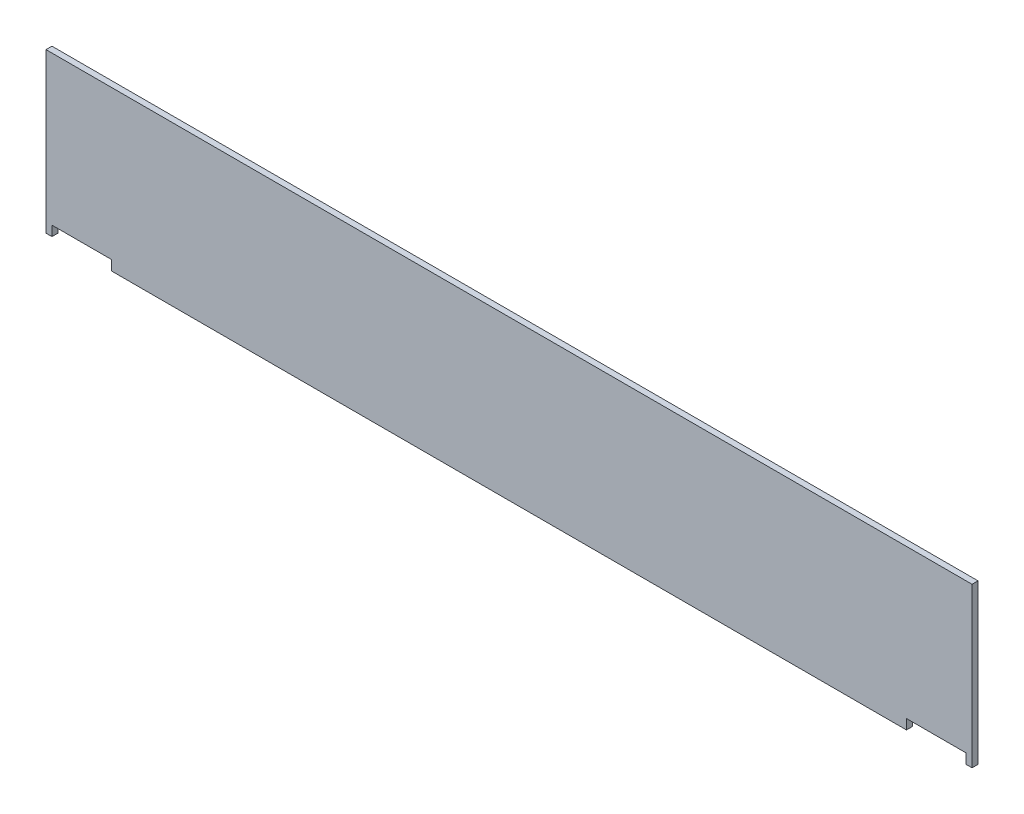
ISO-10303-21;
HEADER;
FILE_DESCRIPTION(('STEP AP214'),'2;1');
FILE_NAME('part.step','',(''),(''),'','','');
FILE_SCHEMA(('AUTOMOTIVE_DESIGN { 1 0 10303 214 1 1 1 1 }'));
ENDSEC;
DATA;
#1=APPLICATION_CONTEXT('core data for automotive mechanical design processes');
#2=APPLICATION_PROTOCOL_DEFINITION('international standard','automotive_design',2000,#1);
#3=PRODUCT_CONTEXT('',#1,'mechanical');
#4=PRODUCT('Part','Part','',(#3));
#5=PRODUCT_RELATED_PRODUCT_CATEGORY('part','',(#4));
#6=PRODUCT_DEFINITION_FORMATION('','',#4);
#7=PRODUCT_DEFINITION_CONTEXT('part definition',#1,'design');
#8=PRODUCT_DEFINITION('design','',#6,#7);
#9=PRODUCT_DEFINITION_SHAPE('','',#8);
#10=(LENGTH_UNIT() NAMED_UNIT(*) SI_UNIT(.MILLI.,.METRE.));
#11=(NAMED_UNIT(*) PLANE_ANGLE_UNIT() SI_UNIT($,.RADIAN.));
#12=(NAMED_UNIT(*) SI_UNIT($,.STERADIAN.) SOLID_ANGLE_UNIT());
#13=UNCERTAINTY_MEASURE_WITH_UNIT(LENGTH_MEASURE(1.E-05),#10,'distance_accuracy_value','');
#14=(GEOMETRIC_REPRESENTATION_CONTEXT(3) GLOBAL_UNCERTAINTY_ASSIGNED_CONTEXT((#13)) GLOBAL_UNIT_ASSIGNED_CONTEXT((#10,
#11,#12)) REPRESENTATION_CONTEXT('',''));
#15=CARTESIAN_POINT('',(0.,0.,0.));
#16=DIRECTION('',(0.,0.,1.));
#17=DIRECTION('',(1.,0.,0.));
#18=AXIS2_PLACEMENT_3D('',#15,#16,#17);
#19=CARTESIAN_POINT('',(-223.652524031518,0.,3.));
#20=DIRECTION('',(0.,1.,0.));
#21=DIRECTION('',(-1.,0.,0.));
#22=AXIS2_PLACEMENT_3D('',#19,#20,#21);
#23=PLANE('',#22);
#24=DIRECTION('',(1.,0.,0.));
#25=VECTOR('',#24,1.);
#26=CARTESIAN_POINT('',(-223.652524031518,0.,0.));
#27=LINE('',#26,#25);
#28=CARTESIAN_POINT('',(-226.652524031518,0.,0.));
#29=VERTEX_POINT('',#28);
#30=CARTESIAN_POINT('',(-223.652524031518,0.,0.));
#31=VERTEX_POINT('',#30);
#32=EDGE_CURVE('E153',#29,#31,#27,.T.);
#33=ORIENTED_EDGE('',*,*,#32,.T.);
#34=DIRECTION('',(0.,0.,-1.));
#35=VECTOR('',#34,1.);
#36=CARTESIAN_POINT('',(-223.652524031518,0.,3.));
#37=LINE('',#36,#35);
#38=CARTESIAN_POINT('',(-223.652524031518,0.,3.));
#39=VERTEX_POINT('',#38);
#40=EDGE_CURVE('E11',#39,#31,#37,.T.);
#41=ORIENTED_EDGE('',*,*,#40,.F.);
#42=DIRECTION('',(1.,0.,0.));
#43=VECTOR('',#42,1.);
#44=CARTESIAN_POINT('',(-223.652524031518,0.,3.));
#45=LINE('',#44,#43);
#46=CARTESIAN_POINT('',(-226.652524031518,0.,3.));
#47=VERTEX_POINT('',#46);
#48=EDGE_CURVE('E175',#47,#39,#45,.T.);
#49=ORIENTED_EDGE('',*,*,#48,.F.);
#50=DIRECTION('',(0.,0.,-1.));
#51=VECTOR('',#50,1.);
#52=CARTESIAN_POINT('',(-226.652524031518,0.,3.));
#53=LINE('',#52,#51);
#54=EDGE_CURVE('E149',#47,#29,#53,.T.);
#55=ORIENTED_EDGE('',*,*,#54,.T.);
#56=EDGE_LOOP('',(#33,#41,#49,#55));
#57=FACE_BOUND('',#56,.T.);
#58=ADVANCED_FACE('F33',(#57),#23,.F.);
#59=CARTESIAN_POINT('',(-223.652524031518,4.99999999999996,3.));
#60=DIRECTION('',(-1.,0.,0.));
#61=DIRECTION('',(0.,-1.,0.));
#62=AXIS2_PLACEMENT_3D('',#59,#60,#61);
#63=PLANE('',#62);
#64=DIRECTION('',(0.,1.,0.));
#65=VECTOR('',#64,1.);
#66=CARTESIAN_POINT('',(-223.652524031518,4.99999999999996,0.));
#67=LINE('',#66,#65);
#68=CARTESIAN_POINT('',(-223.652524031518,4.99999999999996,0.));
#69=VERTEX_POINT('',#68);
#70=EDGE_CURVE('E156',#31,#69,#67,.T.);
#71=ORIENTED_EDGE('',*,*,#70,.T.);
#72=DIRECTION('',(0.,0.,-1.));
#73=VECTOR('',#72,1.);
#74=CARTESIAN_POINT('',(-223.652524031518,4.99999999999996,3.));
#75=LINE('',#74,#73);
#76=CARTESIAN_POINT('',(-223.652524031518,4.99999999999996,3.));
#77=VERTEX_POINT('',#76);
#78=EDGE_CURVE('E41',#77,#69,#75,.T.);
#79=ORIENTED_EDGE('',*,*,#78,.F.);
#80=DIRECTION('',(0.,1.,0.));
#81=VECTOR('',#80,1.);
#82=CARTESIAN_POINT('',(-223.652524031518,4.99999999999996,3.));
#83=LINE('',#82,#81);
#84=EDGE_CURVE('E104',#39,#77,#83,.T.);
#85=ORIENTED_EDGE('',*,*,#84,.F.);
#86=ORIENTED_EDGE('',*,*,#40,.T.);
#87=EDGE_LOOP('',(#71,#79,#85,#86));
#88=FACE_BOUND('',#87,.T.);
#89=ADVANCED_FACE('F253',(#88),#63,.F.);
#90=CARTESIAN_POINT('',(-193.652524031518,4.99999999999996,3.));
#91=DIRECTION('',(0.,1.,0.));
#92=DIRECTION('',(-1.,0.,0.));
#93=AXIS2_PLACEMENT_3D('',#90,#91,#92);
#94=PLANE('',#93);
#95=DIRECTION('',(1.,0.,0.));
#96=VECTOR('',#95,1.);
#97=CARTESIAN_POINT('',(-193.652524031518,4.99999999999996,0.));
#98=LINE('',#97,#96);
#99=CARTESIAN_POINT('',(-193.652524031518,4.99999999999996,0.));
#100=VERTEX_POINT('',#99);
#101=EDGE_CURVE('E158',#69,#100,#98,.T.);
#102=ORIENTED_EDGE('',*,*,#101,.T.);
#103=DIRECTION('',(0.,0.,-1.));
#104=VECTOR('',#103,1.);
#105=CARTESIAN_POINT('',(-193.652524031518,4.99999999999996,3.));
#106=LINE('',#105,#104);
#107=CARTESIAN_POINT('',(-193.652524031518,4.99999999999996,3.));
#108=VERTEX_POINT('',#107);
#109=EDGE_CURVE('E194',#108,#100,#106,.T.);
#110=ORIENTED_EDGE('',*,*,#109,.F.);
#111=DIRECTION('',(1.,0.,0.));
#112=VECTOR('',#111,1.);
#113=CARTESIAN_POINT('',(-193.652524031518,4.99999999999996,3.));
#114=LINE('',#113,#112);
#115=EDGE_CURVE('E202',#77,#108,#114,.T.);
#116=ORIENTED_EDGE('',*,*,#115,.F.);
#117=ORIENTED_EDGE('',*,*,#78,.T.);
#118=EDGE_LOOP('',(#102,#110,#116,#117));
#119=FACE_BOUND('',#118,.T.);
#120=ADVANCED_FACE('F200',(#119),#94,.F.);
#121=CARTESIAN_POINT('',(-193.652524031518,0.,3.));
#122=DIRECTION('',(1.,0.,0.));
#123=DIRECTION('',(0.,0.,-1.));
#124=AXIS2_PLACEMENT_3D('',#121,#122,#123);
#125=PLANE('',#124);
#126=DIRECTION('',(0.,-1.,0.));
#127=VECTOR('',#126,1.);
#128=CARTESIAN_POINT('',(-193.652524031518,0.,0.));
#129=LINE('',#128,#127);
#130=CARTESIAN_POINT('',(-193.652524031518,0.,0.));
#131=VERTEX_POINT('',#130);
#132=EDGE_CURVE('E160',#100,#131,#129,.T.);
#133=ORIENTED_EDGE('',*,*,#132,.T.);
#134=DIRECTION('',(0.,0.,-1.));
#135=VECTOR('',#134,1.);
#136=CARTESIAN_POINT('',(-193.652524031518,0.,3.));
#137=LINE('',#136,#135);
#138=CARTESIAN_POINT('',(-193.652524031518,0.,3.));
#139=VERTEX_POINT('',#138);
#140=EDGE_CURVE('E191',#139,#131,#137,.T.);
#141=ORIENTED_EDGE('',*,*,#140,.F.);
#142=DIRECTION('',(0.,-1.,0.));
#143=VECTOR('',#142,1.);
#144=CARTESIAN_POINT('',(-193.652524031518,0.,3.));
#145=LINE('',#144,#143);
#146=EDGE_CURVE('E220',#108,#139,#145,.T.);
#147=ORIENTED_EDGE('',*,*,#146,.F.);
#148=ORIENTED_EDGE('',*,*,#109,.T.);
#149=EDGE_LOOP('',(#133,#141,#147,#148));
#150=FACE_BOUND('',#149,.T.);
#151=ADVANCED_FACE('F211',(#150),#125,.F.);
#152=CARTESIAN_POINT('',(206.347475968483,0.,3.));
#153=DIRECTION('',(0.,1.,0.));
#154=DIRECTION('',(-1.,0.,0.));
#155=AXIS2_PLACEMENT_3D('',#152,#153,#154);
#156=PLANE('',#155);
#157=DIRECTION('',(1.,0.,0.));
#158=VECTOR('',#157,1.);
#159=CARTESIAN_POINT('',(206.347475968483,0.,0.));
#160=LINE('',#159,#158);
#161=CARTESIAN_POINT('',(206.347475968483,0.,0.));
#162=VERTEX_POINT('',#161);
#163=EDGE_CURVE('E162',#131,#162,#160,.T.);
#164=ORIENTED_EDGE('',*,*,#163,.T.);
#165=DIRECTION('',(0.,0.,-1.));
#166=VECTOR('',#165,1.);
#167=CARTESIAN_POINT('',(206.347475968483,0.,3.));
#168=LINE('',#167,#166);
#169=CARTESIAN_POINT('',(206.347475968483,0.,3.));
#170=VERTEX_POINT('',#169);
#171=EDGE_CURVE('E188',#170,#162,#168,.T.);
#172=ORIENTED_EDGE('',*,*,#171,.F.);
#173=DIRECTION('',(1.,0.,0.));
#174=VECTOR('',#173,1.);
#175=CARTESIAN_POINT('',(206.347475968483,0.,3.));
#176=LINE('',#175,#174);
#177=EDGE_CURVE('E217',#139,#170,#176,.T.);
#178=ORIENTED_EDGE('',*,*,#177,.F.);
#179=ORIENTED_EDGE('',*,*,#140,.T.);
#180=EDGE_LOOP('',(#164,#172,#178,#179));
#181=FACE_BOUND('',#180,.T.);
#182=ADVANCED_FACE('F215',(#181),#156,.F.);
#183=CARTESIAN_POINT('',(206.347475968483,5.,3.));
#184=DIRECTION('',(-1.,0.,0.));
#185=DIRECTION('',(0.,0.,1.));
#186=AXIS2_PLACEMENT_3D('',#183,#184,#185);
#187=PLANE('',#186);
#188=DIRECTION('',(0.,1.,0.));
#189=VECTOR('',#188,1.);
#190=CARTESIAN_POINT('',(206.347475968483,5.,0.));
#191=LINE('',#190,#189);
#192=CARTESIAN_POINT('',(206.347475968483,5.,0.));
#193=VERTEX_POINT('',#192);
#194=EDGE_CURVE('E164',#162,#193,#191,.T.);
#195=ORIENTED_EDGE('',*,*,#194,.T.);
#196=DIRECTION('',(0.,0.,-1.));
#197=VECTOR('',#196,1.);
#198=CARTESIAN_POINT('',(206.347475968483,5.,3.));
#199=LINE('',#198,#197);
#200=CARTESIAN_POINT('',(206.347475968483,5.,3.));
#201=VERTEX_POINT('',#200);
#202=EDGE_CURVE('E185',#201,#193,#199,.T.);
#203=ORIENTED_EDGE('',*,*,#202,.F.);
#204=DIRECTION('',(0.,1.,0.));
#205=VECTOR('',#204,1.);
#206=CARTESIAN_POINT('',(206.347475968483,5.,3.));
#207=LINE('',#206,#205);
#208=EDGE_CURVE('E219',#170,#201,#207,.T.);
#209=ORIENTED_EDGE('',*,*,#208,.F.);
#210=ORIENTED_EDGE('',*,*,#171,.T.);
#211=EDGE_LOOP('',(#195,#203,#209,#210));
#212=FACE_BOUND('',#211,.T.);
#213=ADVANCED_FACE('F266',(#212),#187,.F.);
#214=CARTESIAN_POINT('',(236.347475968483,5.,3.));
#215=DIRECTION('',(0.,1.,0.));
#216=DIRECTION('',(-1.,0.,0.));
#217=AXIS2_PLACEMENT_3D('',#214,#215,#216);
#218=PLANE('',#217);
#219=DIRECTION('',(1.,0.,0.));
#220=VECTOR('',#219,1.);
#221=CARTESIAN_POINT('',(236.347475968483,5.,0.));
#222=LINE('',#221,#220);
#223=CARTESIAN_POINT('',(236.347475968483,5.,0.));
#224=VERTEX_POINT('',#223);
#225=EDGE_CURVE('E166',#193,#224,#222,.T.);
#226=ORIENTED_EDGE('',*,*,#225,.T.);
#227=DIRECTION('',(0.,0.,-1.));
#228=VECTOR('',#227,1.);
#229=CARTESIAN_POINT('',(236.347475968483,5.,3.));
#230=LINE('',#229,#228);
#231=CARTESIAN_POINT('',(236.347475968483,5.,3.));
#232=VERTEX_POINT('',#231);
#233=EDGE_CURVE('E182',#232,#224,#230,.T.);
#234=ORIENTED_EDGE('',*,*,#233,.F.);
#235=DIRECTION('',(1.,0.,0.));
#236=VECTOR('',#235,1.);
#237=CARTESIAN_POINT('',(236.347475968483,5.,3.));
#238=LINE('',#237,#236);
#239=EDGE_CURVE('E222',#201,#232,#238,.T.);
#240=ORIENTED_EDGE('',*,*,#239,.F.);
#241=ORIENTED_EDGE('',*,*,#202,.T.);
#242=EDGE_LOOP('',(#226,#234,#240,#241));
#243=FACE_BOUND('',#242,.T.);
#244=ADVANCED_FACE('F269',(#243),#218,.F.);
#245=CARTESIAN_POINT('',(236.347475968483,0.,3.));
#246=DIRECTION('',(1.,0.,0.));
#247=DIRECTION('',(0.,0.,-1.));
#248=AXIS2_PLACEMENT_3D('',#245,#246,#247);
#249=PLANE('',#248);
#250=DIRECTION('',(0.,-1.,0.));
#251=VECTOR('',#250,1.);
#252=CARTESIAN_POINT('',(236.347475968483,0.,0.));
#253=LINE('',#252,#251);
#254=CARTESIAN_POINT('',(236.347475968483,0.,0.));
#255=VERTEX_POINT('',#254);
#256=EDGE_CURVE('E168',#224,#255,#253,.T.);
#257=ORIENTED_EDGE('',*,*,#256,.T.);
#258=DIRECTION('',(0.,0.,-1.));
#259=VECTOR('',#258,1.);
#260=CARTESIAN_POINT('',(236.347475968483,0.,3.));
#261=LINE('',#260,#259);
#262=CARTESIAN_POINT('',(236.347475968483,0.,3.));
#263=VERTEX_POINT('',#262);
#264=EDGE_CURVE('E179',#263,#255,#261,.T.);
#265=ORIENTED_EDGE('',*,*,#264,.F.);
#266=DIRECTION('',(0.,-1.,0.));
#267=VECTOR('',#266,1.);
#268=CARTESIAN_POINT('',(236.347475968483,0.,3.));
#269=LINE('',#268,#267);
#270=EDGE_CURVE('E228',#232,#263,#269,.T.);
#271=ORIENTED_EDGE('',*,*,#270,.F.);
#272=ORIENTED_EDGE('',*,*,#233,.T.);
#273=EDGE_LOOP('',(#257,#265,#271,#272));
#274=FACE_BOUND('',#273,.T.);
#275=ADVANCED_FACE('F234',(#274),#249,.F.);
#276=CARTESIAN_POINT('',(239.347475968483,0.,3.));
#277=DIRECTION('',(0.,1.,0.));
#278=DIRECTION('',(-1.,0.,0.));
#279=AXIS2_PLACEMENT_3D('',#276,#277,#278);
#280=PLANE('',#279);
#281=DIRECTION('',(1.,0.,0.));
#282=VECTOR('',#281,1.);
#283=CARTESIAN_POINT('',(239.347475968483,0.,0.));
#284=LINE('',#283,#282);
#285=CARTESIAN_POINT('',(239.347475968483,0.,0.));
#286=VERTEX_POINT('',#285);
#287=EDGE_CURVE('E170',#255,#286,#284,.T.);
#288=ORIENTED_EDGE('',*,*,#287,.T.);
#289=DIRECTION('',(0.,0.,-1.));
#290=VECTOR('',#289,1.);
#291=CARTESIAN_POINT('',(239.347475968483,0.,3.));
#292=LINE('',#291,#290);
#293=CARTESIAN_POINT('',(239.347475968483,0.,3.));
#294=VERTEX_POINT('',#293);
#295=EDGE_CURVE('E144',#294,#286,#292,.T.);
#296=ORIENTED_EDGE('',*,*,#295,.F.);
#297=DIRECTION('',(1.,0.,0.));
#298=VECTOR('',#297,1.);
#299=CARTESIAN_POINT('',(239.347475968483,0.,3.));
#300=LINE('',#299,#298);
#301=EDGE_CURVE('E135',#263,#294,#300,.T.);
#302=ORIENTED_EDGE('',*,*,#301,.F.);
#303=ORIENTED_EDGE('',*,*,#264,.T.);
#304=EDGE_LOOP('',(#288,#296,#302,#303));
#305=FACE_BOUND('',#304,.T.);
#306=ADVANCED_FACE('F238',(#305),#280,.F.);
#307=CARTESIAN_POINT('',(239.347475968483,80.,3.));
#308=DIRECTION('',(-1.,0.,0.));
#309=DIRECTION('',(0.,0.,1.));
#310=AXIS2_PLACEMENT_3D('',#307,#308,#309);
#311=PLANE('',#310);
#312=DIRECTION('',(0.,1.,0.));
#313=VECTOR('',#312,1.);
#314=CARTESIAN_POINT('',(239.347475968483,80.,0.));
#315=LINE('',#314,#313);
#316=CARTESIAN_POINT('',(239.347475968483,80.,0.));
#317=VERTEX_POINT('',#316);
#318=EDGE_CURVE('E143',#286,#317,#315,.T.);
#319=ORIENTED_EDGE('',*,*,#318,.T.);
#320=DIRECTION('',(0.,0.,-1.));
#321=VECTOR('',#320,1.);
#322=CARTESIAN_POINT('',(239.347475968483,80.,3.));
#323=LINE('',#322,#321);
#324=CARTESIAN_POINT('',(239.347475968483,80.,3.));
#325=VERTEX_POINT('',#324);
#326=EDGE_CURVE('E140',#325,#317,#323,.T.);
#327=ORIENTED_EDGE('',*,*,#326,.F.);
#328=DIRECTION('',(0.,1.,0.));
#329=VECTOR('',#328,1.);
#330=CARTESIAN_POINT('',(239.347475968483,80.,3.));
#331=LINE('',#330,#329);
#332=EDGE_CURVE('E129',#294,#325,#331,.T.);
#333=ORIENTED_EDGE('',*,*,#332,.F.);
#334=ORIENTED_EDGE('',*,*,#295,.T.);
#335=EDGE_LOOP('',(#319,#327,#333,#334));
#336=FACE_BOUND('',#335,.T.);
#337=ADVANCED_FACE('F141',(#336),#311,.F.);
#338=CARTESIAN_POINT('',(-226.652524031518,80.,3.));
#339=DIRECTION('',(0.,-1.,0.));
#340=DIRECTION('',(0.,0.,-1.));
#341=AXIS2_PLACEMENT_3D('',#338,#339,#340);
#342=PLANE('',#341);
#343=DIRECTION('',(-1.,0.,0.));
#344=VECTOR('',#343,1.);
#345=CARTESIAN_POINT('',(-226.652524031518,80.,0.));
#346=LINE('',#345,#344);
#347=CARTESIAN_POINT('',(-226.652524031518,80.,0.));
#348=VERTEX_POINT('',#347);
#349=EDGE_CURVE('E90',#317,#348,#346,.T.);
#350=ORIENTED_EDGE('',*,*,#349,.T.);
#351=DIRECTION('',(0.,0.,-1.));
#352=VECTOR('',#351,1.);
#353=CARTESIAN_POINT('',(-226.652524031518,80.,3.));
#354=LINE('',#353,#352);
#355=CARTESIAN_POINT('',(-226.652524031518,80.,3.));
#356=VERTEX_POINT('',#355);
#357=EDGE_CURVE('E145',#356,#348,#354,.T.);
#358=ORIENTED_EDGE('',*,*,#357,.F.);
#359=DIRECTION('',(-1.,0.,0.));
#360=VECTOR('',#359,1.);
#361=CARTESIAN_POINT('',(-226.652524031518,80.,3.));
#362=LINE('',#361,#360);
#363=EDGE_CURVE('E133',#325,#356,#362,.T.);
#364=ORIENTED_EDGE('',*,*,#363,.F.);
#365=ORIENTED_EDGE('',*,*,#326,.T.);
#366=EDGE_LOOP('',(#350,#358,#364,#365));
#367=FACE_BOUND('',#366,.T.);
#368=ADVANCED_FACE('F147',(#367),#342,.F.);
#369=CARTESIAN_POINT('',(-226.652524031518,0.,3.));
#370=DIRECTION('',(1.,0.,0.));
#371=DIRECTION('',(0.,1.,0.));
#372=AXIS2_PLACEMENT_3D('',#369,#370,#371);
#373=PLANE('',#372);
#374=DIRECTION('',(0.,-1.,0.));
#375=VECTOR('',#374,1.);
#376=CARTESIAN_POINT('',(-226.652524031518,0.,0.));
#377=LINE('',#376,#375);
#378=EDGE_CURVE('E96',#348,#29,#377,.T.);
#379=ORIENTED_EDGE('',*,*,#378,.T.);
#380=ORIENTED_EDGE('',*,*,#54,.F.);
#381=DIRECTION('',(0.,-1.,0.));
#382=VECTOR('',#381,1.);
#383=CARTESIAN_POINT('',(-226.652524031518,0.,3.));
#384=LINE('',#383,#382);
#385=EDGE_CURVE('E49',#356,#47,#384,.T.);
#386=ORIENTED_EDGE('',*,*,#385,.F.);
#387=ORIENTED_EDGE('',*,*,#357,.T.);
#388=EDGE_LOOP('',(#379,#380,#386,#387));
#389=FACE_BOUND('',#388,.T.);
#390=ADVANCED_FACE('F242',(#389),#373,.F.);
#391=CARTESIAN_POINT('',(0.,0.,3.));
#392=DIRECTION('',(0.,0.,-1.));
#393=DIRECTION('',(-1.,0.,0.));
#394=AXIS2_PLACEMENT_3D('',#391,#392,#393);
#395=PLANE('',#394);
#396=ORIENTED_EDGE('',*,*,#48,.T.);
#397=ORIENTED_EDGE('',*,*,#84,.T.);
#398=ORIENTED_EDGE('',*,*,#115,.T.);
#399=ORIENTED_EDGE('',*,*,#146,.T.);
#400=ORIENTED_EDGE('',*,*,#177,.T.);
#401=ORIENTED_EDGE('',*,*,#208,.T.);
#402=ORIENTED_EDGE('',*,*,#239,.T.);
#403=ORIENTED_EDGE('',*,*,#270,.T.);
#404=ORIENTED_EDGE('',*,*,#301,.T.);
#405=ORIENTED_EDGE('',*,*,#332,.T.);
#406=ORIENTED_EDGE('',*,*,#363,.T.);
#407=ORIENTED_EDGE('',*,*,#385,.T.);
#408=EDGE_LOOP('',(#396,#397,#398,#399,#400,#401,#402,#403,#404,#405,#406,#407));
#409=FACE_BOUND('',#408,.T.);
#410=ADVANCED_FACE('F131',(#409),#395,.F.);
#411=CARTESIAN_POINT('',(0.,0.,0.));
#412=DIRECTION('',(0.,0.,-1.));
#413=DIRECTION('',(-1.,0.,0.));
#414=AXIS2_PLACEMENT_3D('',#411,#412,#413);
#415=PLANE('',#414);
#416=ORIENTED_EDGE('',*,*,#32,.F.);
#417=ORIENTED_EDGE('',*,*,#378,.F.);
#418=ORIENTED_EDGE('',*,*,#349,.F.);
#419=ORIENTED_EDGE('',*,*,#318,.F.);
#420=ORIENTED_EDGE('',*,*,#287,.F.);
#421=ORIENTED_EDGE('',*,*,#256,.F.);
#422=ORIENTED_EDGE('',*,*,#225,.F.);
#423=ORIENTED_EDGE('',*,*,#194,.F.);
#424=ORIENTED_EDGE('',*,*,#163,.F.);
#425=ORIENTED_EDGE('',*,*,#132,.F.);
#426=ORIENTED_EDGE('',*,*,#101,.F.);
#427=ORIENTED_EDGE('',*,*,#70,.F.);
#428=EDGE_LOOP('',(#416,#417,#418,#419,#420,#421,#422,#423,#424,#425,#426,#427));
#429=FACE_BOUND('',#428,.T.);
#430=ADVANCED_FACE('F206',(#429),#415,.T.);
#431=CLOSED_SHELL('',(#58,#89,#120,#151,#182,#213,#244,#275,#306,#337,#368,#390,#410,#430));
#432=MANIFOLD_SOLID_BREP('B2',#431);
#433=ADVANCED_BREP_SHAPE_REPRESENTATION('',(#18,#432),#14);
#434=SHAPE_DEFINITION_REPRESENTATION(#9,#433);
ENDSEC;
END-ISO-10303-21;
